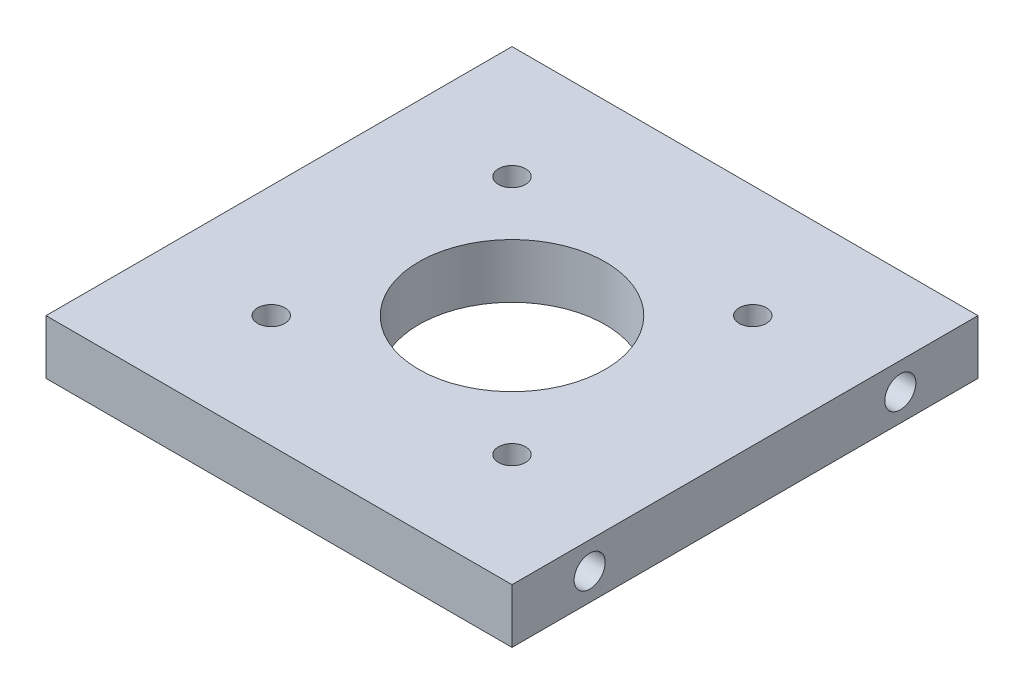
ISO-10303-21;
HEADER;
FILE_DESCRIPTION(('STEP AP214'),'2;1');
FILE_NAME('part.step','',(''),(''),'','','');
FILE_SCHEMA(('AUTOMOTIVE_DESIGN { 1 0 10303 214 1 1 1 1 }'));
ENDSEC;
DATA;
#1=APPLICATION_CONTEXT('core data for automotive mechanical design processes');
#2=APPLICATION_PROTOCOL_DEFINITION('international standard','automotive_design',2000,#1);
#3=PRODUCT_CONTEXT('',#1,'mechanical');
#4=PRODUCT('Part','Part','',(#3));
#5=PRODUCT_RELATED_PRODUCT_CATEGORY('part','',(#4));
#6=PRODUCT_DEFINITION_FORMATION('','',#4);
#7=PRODUCT_DEFINITION_CONTEXT('part definition',#1,'design');
#8=PRODUCT_DEFINITION('design','',#6,#7);
#9=PRODUCT_DEFINITION_SHAPE('','',#8);
#10=(LENGTH_UNIT() NAMED_UNIT(*) SI_UNIT(.MILLI.,.METRE.));
#11=(NAMED_UNIT(*) PLANE_ANGLE_UNIT() SI_UNIT($,.RADIAN.));
#12=(NAMED_UNIT(*) SI_UNIT($,.STERADIAN.) SOLID_ANGLE_UNIT());
#13=UNCERTAINTY_MEASURE_WITH_UNIT(LENGTH_MEASURE(1.E-05),#10,'distance_accuracy_value','');
#14=(GEOMETRIC_REPRESENTATION_CONTEXT(3) GLOBAL_UNCERTAINTY_ASSIGNED_CONTEXT((#13)) GLOBAL_UNIT_ASSIGNED_CONTEXT((#10,
#11,#12)) REPRESENTATION_CONTEXT('',''));
#15=CARTESIAN_POINT('',(0.,0.,0.));
#16=DIRECTION('',(0.,0.,1.));
#17=DIRECTION('',(1.,0.,0.));
#18=AXIS2_PLACEMENT_3D('',#15,#16,#17);
#19=CARTESIAN_POINT('',(50.0014,3.5084,50.000003548781));
#20=DIRECTION('',(-1.,0.,0.));
#21=DIRECTION('',(0.,0.,1.));
#22=AXIS2_PLACEMENT_3D('',#19,#20,#21);
#23=PLANE('',#22);
#24=CARTESIAN_POINT('',(50.0014,3.5084,50.000003548781));
#25=DIRECTION('',(-1.,0.,0.));
#26=DIRECTION('',(0.,0.,1.));
#27=AXIS2_PLACEMENT_3D('',#24,#25,#26);
#28=CIRCLE('',#27,2.);
#29=CARTESIAN_POINT('',(50.0014,3.5084,52.000003548781));
#30=VERTEX_POINT('',#29);
#31=EDGE_CURVE('E19',#30,#30,#28,.F.);
#32=ORIENTED_EDGE('',*,*,#31,.T.);
#33=EDGE_LOOP('',(#32));
#34=FACE_BOUND('',#33,.T.);
#35=ADVANCED_FACE('F16',(#34),#23,.F.);
#36=CARTESIAN_POINT('',(50.0014,3.5084,10.000003548781));
#37=DIRECTION('',(-1.,0.,0.));
#38=DIRECTION('',(0.,0.,1.));
#39=AXIS2_PLACEMENT_3D('',#36,#37,#38);
#40=PLANE('',#39);
#41=CARTESIAN_POINT('',(50.0014,3.5084,10.000003548781));
#42=DIRECTION('',(-1.,0.,0.));
#43=DIRECTION('',(0.,0.,1.));
#44=AXIS2_PLACEMENT_3D('',#41,#42,#43);
#45=CIRCLE('',#44,2.);
#46=CARTESIAN_POINT('',(50.0014,3.5084,12.000003548781));
#47=VERTEX_POINT('',#46);
#48=EDGE_CURVE('E128',#47,#47,#45,.F.);
#49=ORIENTED_EDGE('',*,*,#48,.T.);
#50=EDGE_LOOP('',(#49));
#51=FACE_BOUND('',#50,.T.);
#52=ADVANCED_FACE('F210',(#51),#40,.F.);
#53=CARTESIAN_POINT('',(10.0014,3.5084,50.000003548781));
#54=DIRECTION('',(1.,0.,0.));
#55=DIRECTION('',(0.,0.,-1.));
#56=AXIS2_PLACEMENT_3D('',#53,#54,#55);
#57=PLANE('',#56);
#58=CARTESIAN_POINT('',(10.0014,3.5084,50.000003548781));
#59=DIRECTION('',(1.,0.,0.));
#60=DIRECTION('',(0.,0.,-1.));
#61=AXIS2_PLACEMENT_3D('',#58,#59,#60);
#62=CIRCLE('',#61,2.);
#63=CARTESIAN_POINT('',(10.0014,3.5084,48.000003548781));
#64=VERTEX_POINT('',#63);
#65=EDGE_CURVE('E126',#64,#64,#62,.F.);
#66=ORIENTED_EDGE('',*,*,#65,.T.);
#67=EDGE_LOOP('',(#66));
#68=FACE_BOUND('',#67,.T.);
#69=ADVANCED_FACE('F150',(#68),#57,.F.);
#70=CARTESIAN_POINT('',(10.0014,3.5084,10.000003548781));
#71=DIRECTION('',(1.,0.,0.));
#72=DIRECTION('',(0.,0.,-1.));
#73=AXIS2_PLACEMENT_3D('',#70,#71,#72);
#74=PLANE('',#73);
#75=CARTESIAN_POINT('',(10.0014,3.5084,10.000003548781));
#76=DIRECTION('',(1.,0.,0.));
#77=DIRECTION('',(0.,0.,-1.));
#78=AXIS2_PLACEMENT_3D('',#75,#76,#77);
#79=CIRCLE('',#78,2.);
#80=CARTESIAN_POINT('',(10.0014,3.5084,8.000003548781));
#81=VERTEX_POINT('',#80);
#82=EDGE_CURVE('E74',#81,#81,#79,.F.);
#83=ORIENTED_EDGE('',*,*,#82,.T.);
#84=EDGE_LOOP('',(#83));
#85=FACE_BOUND('',#84,.T.);
#86=ADVANCED_FACE('F139',(#85),#74,.F.);
#87=CARTESIAN_POINT('',(60.0014,3.5084,50.000003548781));
#88=DIRECTION('',(-1.,0.,0.));
#89=DIRECTION('',(0.,0.,1.));
#90=AXIS2_PLACEMENT_3D('',#87,#88,#89);
#91=CYLINDRICAL_SURFACE('',#90,2.);
#92=CARTESIAN_POINT('',(60.0014,3.5084,50.000003548781));
#93=DIRECTION('',(-1.,0.,0.));
#94=DIRECTION('',(0.,0.,1.));
#95=AXIS2_PLACEMENT_3D('',#92,#93,#94);
#96=CIRCLE('',#95,2.);
#97=CARTESIAN_POINT('',(60.0014,3.5084,52.000003548781));
#98=VERTEX_POINT('',#97);
#99=EDGE_CURVE('E73',#98,#98,#96,.F.);
#100=ORIENTED_EDGE('',*,*,#99,.T.);
#101=EDGE_LOOP('',(#100));
#102=FACE_BOUND('',#101,.T.);
#103=ORIENTED_EDGE('',*,*,#31,.F.);
#104=EDGE_LOOP('',(#103));
#105=FACE_BOUND('',#104,.T.);
#106=ADVANCED_FACE('F136',(#102,#105),#91,.F.);
#107=CARTESIAN_POINT('',(60.0014,3.5084,10.000003548781));
#108=DIRECTION('',(-1.,0.,0.));
#109=DIRECTION('',(0.,0.,1.));
#110=AXIS2_PLACEMENT_3D('',#107,#108,#109);
#111=CYLINDRICAL_SURFACE('',#110,2.);
#112=CARTESIAN_POINT('',(60.0014,3.5084,10.000003548781));
#113=DIRECTION('',(-1.,0.,0.));
#114=DIRECTION('',(0.,0.,1.));
#115=AXIS2_PLACEMENT_3D('',#112,#113,#114);
#116=CIRCLE('',#115,2.);
#117=CARTESIAN_POINT('',(60.0014,3.5084,12.000003548781));
#118=VERTEX_POINT('',#117);
#119=EDGE_CURVE('E65',#118,#118,#116,.F.);
#120=ORIENTED_EDGE('',*,*,#119,.T.);
#121=EDGE_LOOP('',(#120));
#122=FACE_BOUND('',#121,.T.);
#123=ORIENTED_EDGE('',*,*,#48,.F.);
#124=EDGE_LOOP('',(#123));
#125=FACE_BOUND('',#124,.T.);
#126=ADVANCED_FACE('F138',(#122,#125),#111,.F.);
#127=CARTESIAN_POINT('',(0.00139999999999,3.5084,50.000003548781));
#128=DIRECTION('',(1.,0.,0.));
#129=DIRECTION('',(0.,0.,-1.));
#130=AXIS2_PLACEMENT_3D('',#127,#128,#129);
#131=CYLINDRICAL_SURFACE('',#130,2.);
#132=CARTESIAN_POINT('',(0.001399999999997,3.5084,50.000003548781));
#133=DIRECTION('',(1.,0.,0.));
#134=DIRECTION('',(0.,0.,-1.));
#135=AXIS2_PLACEMENT_3D('',#132,#133,#134);
#136=CIRCLE('',#135,2.);
#137=CARTESIAN_POINT('',(0.001399999999997,3.5084,48.000003548781));
#138=VERTEX_POINT('',#137);
#139=EDGE_CURVE('E117',#138,#138,#136,.T.);
#140=ORIENTED_EDGE('',*,*,#139,.F.);
#141=EDGE_LOOP('',(#140));
#142=FACE_BOUND('',#141,.T.);
#143=ORIENTED_EDGE('',*,*,#65,.F.);
#144=EDGE_LOOP('',(#143));
#145=FACE_BOUND('',#144,.T.);
#146=ADVANCED_FACE('F147',(#142,#145),#131,.F.);
#147=CARTESIAN_POINT('',(0.00139999999999,3.5084,10.000003548781));
#148=DIRECTION('',(1.,0.,0.));
#149=DIRECTION('',(0.,0.,-1.));
#150=AXIS2_PLACEMENT_3D('',#147,#148,#149);
#151=CYLINDRICAL_SURFACE('',#150,2.);
#152=CARTESIAN_POINT('',(0.001399999999997,3.5084,10.000003548781));
#153=DIRECTION('',(1.,0.,0.));
#154=DIRECTION('',(0.,0.,-1.));
#155=AXIS2_PLACEMENT_3D('',#152,#153,#154);
#156=CIRCLE('',#155,2.);
#157=CARTESIAN_POINT('',(0.001399999999997,3.5084,8.000003548781));
#158=VERTEX_POINT('',#157);
#159=EDGE_CURVE('E113',#158,#158,#156,.T.);
#160=ORIENTED_EDGE('',*,*,#159,.F.);
#161=EDGE_LOOP('',(#160));
#162=FACE_BOUND('',#161,.T.);
#163=ORIENTED_EDGE('',*,*,#82,.F.);
#164=EDGE_LOOP('',(#163));
#165=FACE_BOUND('',#164,.T.);
#166=ADVANCED_FACE('F196',(#162,#165),#151,.F.);
#167=CARTESIAN_POINT('',(60.0014,0.008400000000165,3.54878102371E-06));
#168=DIRECTION('',(0.,1.,0.));
#169=DIRECTION('',(0.,0.,1.));
#170=AXIS2_PLACEMENT_3D('',#167,#168,#169);
#171=PLANE('',#170);
#172=CARTESIAN_POINT('',(14.5014,0.008400000000051,45.500003548781));
#173=DIRECTION('',(0.,1.,0.));
#174=DIRECTION('',(0.,0.,1.));
#175=AXIS2_PLACEMENT_3D('',#172,#173,#174);
#176=CIRCLE('',#175,1.75);
#177=CARTESIAN_POINT('',(14.5014,0.008400000000051,47.250003548781));
#178=VERTEX_POINT('',#177);
#179=EDGE_CURVE('E97',#178,#178,#176,.T.);
#180=ORIENTED_EDGE('',*,*,#179,.T.);
#181=EDGE_LOOP('',(#180));
#182=FACE_BOUND('',#181,.T.);
#183=CARTESIAN_POINT('',(30.0014,0.008400000000051,30.000003548781));
#184=DIRECTION('',(0.,1.,0.));
#185=DIRECTION('',(0.,0.,1.));
#186=AXIS2_PLACEMENT_3D('',#183,#184,#185);
#187=CIRCLE('',#186,12.);
#188=CARTESIAN_POINT('',(30.0014,0.008400000000051,42.000003548781));
#189=VERTEX_POINT('',#188);
#190=EDGE_CURVE('E101',#189,#189,#187,.T.);
#191=ORIENTED_EDGE('',*,*,#190,.T.);
#192=EDGE_LOOP('',(#191));
#193=FACE_BOUND('',#192,.T.);
#194=CARTESIAN_POINT('',(45.5014,0.008400000000051,45.500003548781));
#195=DIRECTION('',(0.,1.,0.));
#196=DIRECTION('',(0.,0.,1.));
#197=AXIS2_PLACEMENT_3D('',#194,#195,#196);
#198=CIRCLE('',#197,1.75);
#199=CARTESIAN_POINT('',(45.5014,0.008400000000051,47.250003548781));
#200=VERTEX_POINT('',#199);
#201=EDGE_CURVE('E104',#200,#200,#198,.T.);
#202=ORIENTED_EDGE('',*,*,#201,.T.);
#203=EDGE_LOOP('',(#202));
#204=FACE_BOUND('',#203,.T.);
#205=CARTESIAN_POINT('',(14.5014,0.008400000000051,14.500003548781));
#206=DIRECTION('',(0.,1.,0.));
#207=DIRECTION('',(0.,0.,1.));
#208=AXIS2_PLACEMENT_3D('',#205,#206,#207);
#209=CIRCLE('',#208,1.75);
#210=CARTESIAN_POINT('',(14.5014,0.008400000000051,16.250003548781));
#211=VERTEX_POINT('',#210);
#212=EDGE_CURVE('E107',#211,#211,#209,.T.);
#213=ORIENTED_EDGE('',*,*,#212,.T.);
#214=EDGE_LOOP('',(#213));
#215=FACE_BOUND('',#214,.T.);
#216=CARTESIAN_POINT('',(45.5014,0.008400000000051,14.500003548781));
#217=DIRECTION('',(0.,1.,0.));
#218=DIRECTION('',(0.,0.,1.));
#219=AXIS2_PLACEMENT_3D('',#216,#217,#218);
#220=CIRCLE('',#219,1.75);
#221=CARTESIAN_POINT('',(45.5014,0.008400000000051,16.250003548781));
#222=VERTEX_POINT('',#221);
#223=EDGE_CURVE('E110',#222,#222,#220,.T.);
#224=ORIENTED_EDGE('',*,*,#223,.T.);
#225=EDGE_LOOP('',(#224));
#226=FACE_BOUND('',#225,.T.);
#227=DIRECTION('',(0.,0.,1.));
#228=VECTOR('',#227,1.);
#229=CARTESIAN_POINT('',(0.00139999999999,0.008400000000051,3.54878102371E-06));
#230=LINE('',#229,#228);
#231=CARTESIAN_POINT('',(0.00139999999999647,0.0084000000000795,3.548780910023E-06));
#232=VERTEX_POINT('',#231);
#233=CARTESIAN_POINT('',(0.00139999999999647,0.008400000000108,60.000003548781));
#234=VERTEX_POINT('',#233);
#235=EDGE_CURVE('E62',#232,#234,#230,.T.);
#236=ORIENTED_EDGE('',*,*,#235,.F.);
#237=DIRECTION('',(1.,0.,0.));
#238=VECTOR('',#237,1.);
#239=CARTESIAN_POINT('',(60.0014,0.008400000000051,3.54878102371E-06));
#240=LINE('',#239,#238);
#241=CARTESIAN_POINT('',(60.0014,0.008400000000108,3.5487808531795E-06));
#242=VERTEX_POINT('',#241);
#243=EDGE_CURVE('E55',#232,#242,#240,.T.);
#244=ORIENTED_EDGE('',*,*,#243,.T.);
#245=DIRECTION('',(0.,0.,1.));
#246=VECTOR('',#245,1.);
#247=CARTESIAN_POINT('',(60.0014,0.008400000000051,3.54878102371E-06));
#248=LINE('',#247,#246);
#249=CARTESIAN_POINT('',(60.0014,0.008400000000108,60.000003548781));
#250=VERTEX_POINT('',#249);
#251=EDGE_CURVE('E60',#242,#250,#248,.T.);
#252=ORIENTED_EDGE('',*,*,#251,.T.);
#253=DIRECTION('',(1.,0.,0.));
#254=VECTOR('',#253,1.);
#255=CARTESIAN_POINT('',(60.0014,0.008400000000051,60.000003548781));
#256=LINE('',#255,#254);
#257=EDGE_CURVE('E116',#234,#250,#256,.T.);
#258=ORIENTED_EDGE('',*,*,#257,.F.);
#259=EDGE_LOOP('',(#236,#244,#252,#258));
#260=FACE_BOUND('',#259,.T.);
#261=ADVANCED_FACE('F59',(#182,#193,#204,#215,#226,#260),#171,.F.);
#262=CARTESIAN_POINT('',(60.0014,0.008400000000165,3.54878102371E-06));
#263=DIRECTION('',(-1.,0.,0.));
#264=DIRECTION('',(0.,0.,1.));
#265=AXIS2_PLACEMENT_3D('',#262,#263,#264);
#266=PLANE('',#265);
#267=ORIENTED_EDGE('',*,*,#119,.F.);
#268=EDGE_LOOP('',(#267));
#269=FACE_BOUND('',#268,.T.);
#270=ORIENTED_EDGE('',*,*,#99,.F.);
#271=EDGE_LOOP('',(#270));
#272=FACE_BOUND('',#271,.T.);
#273=DIRECTION('',(0.,1.,0.));
#274=VECTOR('',#273,1.);
#275=CARTESIAN_POINT('',(60.0014,0.008400000000165,60.000003548781));
#276=LINE('',#275,#274);
#277=CARTESIAN_POINT('',(60.0014,7.0084,60.000003548781));
#278=VERTEX_POINT('',#277);
#279=EDGE_CURVE('E71',#250,#278,#276,.T.);
#280=ORIENTED_EDGE('',*,*,#279,.F.);
#281=ORIENTED_EDGE('',*,*,#251,.F.);
#282=DIRECTION('',(0.,1.,0.));
#283=VECTOR('',#282,1.);
#284=CARTESIAN_POINT('',(60.0014,0.008400000000165,3.54878102371E-06));
#285=LINE('',#284,#283);
#286=CARTESIAN_POINT('',(60.0014,7.0084,3.5487808531795E-06));
#287=VERTEX_POINT('',#286);
#288=EDGE_CURVE('E64',#242,#287,#285,.T.);
#289=ORIENTED_EDGE('',*,*,#288,.T.);
#290=DIRECTION('',(0.,0.,1.));
#291=VECTOR('',#290,1.);
#292=CARTESIAN_POINT('',(60.0014,7.0084,3.54878102371E-06));
#293=LINE('',#292,#291);
#294=EDGE_CURVE('E100',#278,#287,#293,.F.);
#295=ORIENTED_EDGE('',*,*,#294,.F.);
#296=EDGE_LOOP('',(#280,#281,#289,#295));
#297=FACE_BOUND('',#296,.T.);
#298=ADVANCED_FACE('F68',(#269,#272,#297),#266,.F.);
#299=CARTESIAN_POINT('',(60.0014,0.008400000000165,3.54878102371E-06));
#300=DIRECTION('',(0.,0.,1.));
#301=DIRECTION('',(1.,0.,0.));
#302=AXIS2_PLACEMENT_3D('',#299,#300,#301);
#303=PLANE('',#302);
#304=DIRECTION('',(1.,0.,0.));
#305=VECTOR('',#304,1.);
#306=CARTESIAN_POINT('',(60.0014,7.0084,3.548780796336E-06));
#307=LINE('',#306,#305);
#308=CARTESIAN_POINT('',(0.00139999999999647,7.0084,3.548780910023E-06));
#309=VERTEX_POINT('',#308);
#310=EDGE_CURVE('E78',#287,#309,#307,.F.);
#311=ORIENTED_EDGE('',*,*,#310,.F.);
#312=ORIENTED_EDGE('',*,*,#288,.F.);
#313=ORIENTED_EDGE('',*,*,#243,.F.);
#314=DIRECTION('',(0.,1.,0.));
#315=VECTOR('',#314,1.);
#316=CARTESIAN_POINT('',(0.00139999999999,0.008400000000165,3.548780796336E-06));
#317=LINE('',#316,#315);
#318=EDGE_CURVE('E80',#309,#232,#317,.F.);
#319=ORIENTED_EDGE('',*,*,#318,.F.);
#320=EDGE_LOOP('',(#311,#312,#313,#319));
#321=FACE_BOUND('',#320,.T.);
#322=ADVANCED_FACE('F76',(#321),#303,.F.);
#323=CARTESIAN_POINT('',(0.00139999999999,0.008400000000165,3.54878102371E-06));
#324=DIRECTION('',(-1.,0.,0.));
#325=DIRECTION('',(0.,0.,1.));
#326=AXIS2_PLACEMENT_3D('',#323,#324,#325);
#327=PLANE('',#326);
#328=ORIENTED_EDGE('',*,*,#159,.T.);
#329=EDGE_LOOP('',(#328));
#330=FACE_BOUND('',#329,.T.);
#331=ORIENTED_EDGE('',*,*,#139,.T.);
#332=EDGE_LOOP('',(#331));
#333=FACE_BOUND('',#332,.T.);
#334=DIRECTION('',(0.,1.,0.));
#335=VECTOR('',#334,1.);
#336=CARTESIAN_POINT('',(0.00139999999999862,0.008400000000165,60.000003548781));
#337=LINE('',#336,#335);
#338=CARTESIAN_POINT('',(0.00139999999999431,7.0084,60.000003548781));
#339=VERTEX_POINT('',#338);
#340=EDGE_CURVE('E34',#339,#234,#337,.F.);
#341=ORIENTED_EDGE('',*,*,#340,.F.);
#342=DIRECTION('',(0.,0.,1.));
#343=VECTOR('',#342,1.);
#344=CARTESIAN_POINT('',(0.00139999999999862,7.0084,3.54878102371E-06));
#345=LINE('',#344,#343);
#346=EDGE_CURVE('E348',#309,#339,#345,.T.);
#347=ORIENTED_EDGE('',*,*,#346,.F.);
#348=ORIENTED_EDGE('',*,*,#318,.T.);
#349=ORIENTED_EDGE('',*,*,#235,.T.);
#350=EDGE_LOOP('',(#341,#347,#348,#349));
#351=FACE_BOUND('',#350,.T.);
#352=ADVANCED_FACE('F184',(#330,#333,#351),#327,.T.);
#353=CARTESIAN_POINT('',(60.0014,0.008400000000165,60.000003548781));
#354=DIRECTION('',(0.,0.,1.));
#355=DIRECTION('',(1.,0.,0.));
#356=AXIS2_PLACEMENT_3D('',#353,#354,#355);
#357=PLANE('',#356);
#358=DIRECTION('',(1.,0.,0.));
#359=VECTOR('',#358,1.);
#360=CARTESIAN_POINT('',(60.0014,7.0084,60.000003548781));
#361=LINE('',#360,#359);
#362=EDGE_CURVE('E96',#339,#278,#361,.T.);
#363=ORIENTED_EDGE('',*,*,#362,.F.);
#364=ORIENTED_EDGE('',*,*,#340,.T.);
#365=ORIENTED_EDGE('',*,*,#257,.T.);
#366=ORIENTED_EDGE('',*,*,#279,.T.);
#367=EDGE_LOOP('',(#363,#364,#365,#366));
#368=FACE_BOUND('',#367,.T.);
#369=ADVANCED_FACE('F180',(#368),#357,.T.);
#370=CARTESIAN_POINT('',(45.5014,0.008400000000165,14.500003548781));
#371=DIRECTION('',(0.,1.,0.));
#372=DIRECTION('',(0.,0.,1.));
#373=AXIS2_PLACEMENT_3D('',#370,#371,#372);
#374=CYLINDRICAL_SURFACE('',#373,1.75);
#375=ORIENTED_EDGE('',*,*,#223,.F.);
#376=EDGE_LOOP('',(#375));
#377=FACE_BOUND('',#376,.T.);
#378=CARTESIAN_POINT('',(45.5014,7.0084,14.500003548781));
#379=DIRECTION('',(0.,1.,0.));
#380=DIRECTION('',(0.,0.,1.));
#381=AXIS2_PLACEMENT_3D('',#378,#379,#380);
#382=CIRCLE('',#381,1.75);
#383=CARTESIAN_POINT('',(45.5014,7.0084,16.250003548781));
#384=VERTEX_POINT('',#383);
#385=EDGE_CURVE('E93',#384,#384,#382,.F.);
#386=ORIENTED_EDGE('',*,*,#385,.F.);
#387=EDGE_LOOP('',(#386));
#388=FACE_BOUND('',#387,.T.);
#389=ADVANCED_FACE('F176',(#377,#388),#374,.F.);
#390=CARTESIAN_POINT('',(14.5014,0.008400000000165,14.500003548781));
#391=DIRECTION('',(0.,1.,0.));
#392=DIRECTION('',(0.,0.,1.));
#393=AXIS2_PLACEMENT_3D('',#390,#391,#392);
#394=CYLINDRICAL_SURFACE('',#393,1.75);
#395=ORIENTED_EDGE('',*,*,#212,.F.);
#396=EDGE_LOOP('',(#395));
#397=FACE_BOUND('',#396,.T.);
#398=CARTESIAN_POINT('',(14.5014,7.0084,14.500003548781));
#399=DIRECTION('',(0.,1.,0.));
#400=DIRECTION('',(0.,0.,1.));
#401=AXIS2_PLACEMENT_3D('',#398,#399,#400);
#402=CIRCLE('',#401,1.75);
#403=CARTESIAN_POINT('',(14.5014,7.0084,16.250003548781));
#404=VERTEX_POINT('',#403);
#405=EDGE_CURVE('E90',#404,#404,#402,.F.);
#406=ORIENTED_EDGE('',*,*,#405,.F.);
#407=EDGE_LOOP('',(#406));
#408=FACE_BOUND('',#407,.T.);
#409=ADVANCED_FACE('F172',(#397,#408),#394,.F.);
#410=CARTESIAN_POINT('',(45.5014,0.008400000000165,45.500003548781));
#411=DIRECTION('',(0.,1.,0.));
#412=DIRECTION('',(0.,0.,1.));
#413=AXIS2_PLACEMENT_3D('',#410,#411,#412);
#414=CYLINDRICAL_SURFACE('',#413,1.75);
#415=ORIENTED_EDGE('',*,*,#201,.F.);
#416=EDGE_LOOP('',(#415));
#417=FACE_BOUND('',#416,.T.);
#418=CARTESIAN_POINT('',(45.5014,7.0084,45.500003548781));
#419=DIRECTION('',(0.,1.,0.));
#420=DIRECTION('',(0.,0.,1.));
#421=AXIS2_PLACEMENT_3D('',#418,#419,#420);
#422=CIRCLE('',#421,1.75);
#423=CARTESIAN_POINT('',(45.5014,7.0084,47.250003548781));
#424=VERTEX_POINT('',#423);
#425=EDGE_CURVE('E87',#424,#424,#422,.F.);
#426=ORIENTED_EDGE('',*,*,#425,.F.);
#427=EDGE_LOOP('',(#426));
#428=FACE_BOUND('',#427,.T.);
#429=ADVANCED_FACE('F168',(#417,#428),#414,.F.);
#430=CARTESIAN_POINT('',(30.0014,0.008400000000165,30.000003548781));
#431=DIRECTION('',(0.,1.,0.));
#432=DIRECTION('',(0.,0.,1.));
#433=AXIS2_PLACEMENT_3D('',#430,#431,#432);
#434=CYLINDRICAL_SURFACE('',#433,12.);
#435=ORIENTED_EDGE('',*,*,#190,.F.);
#436=EDGE_LOOP('',(#435));
#437=FACE_BOUND('',#436,.T.);
#438=CARTESIAN_POINT('',(30.0014,7.0084,30.000003548781));
#439=DIRECTION('',(0.,1.,0.));
#440=DIRECTION('',(0.,0.,1.));
#441=AXIS2_PLACEMENT_3D('',#438,#439,#440);
#442=CIRCLE('',#441,12.);
#443=CARTESIAN_POINT('',(30.0014,7.0084,42.000003548781));
#444=VERTEX_POINT('',#443);
#445=EDGE_CURVE('E25',#444,#444,#442,.F.);
#446=ORIENTED_EDGE('',*,*,#445,.F.);
#447=EDGE_LOOP('',(#446));
#448=FACE_BOUND('',#447,.T.);
#449=ADVANCED_FACE('F161',(#437,#448),#434,.F.);
#450=CARTESIAN_POINT('',(14.5014,0.008400000000165,45.500003548781));
#451=DIRECTION('',(0.,1.,0.));
#452=DIRECTION('',(0.,0.,1.));
#453=AXIS2_PLACEMENT_3D('',#450,#451,#452);
#454=CYLINDRICAL_SURFACE('',#453,1.75);
#455=ORIENTED_EDGE('',*,*,#179,.F.);
#456=EDGE_LOOP('',(#455));
#457=FACE_BOUND('',#456,.T.);
#458=CARTESIAN_POINT('',(14.5014,7.0084,45.500003548781));
#459=DIRECTION('',(0.,1.,0.));
#460=DIRECTION('',(0.,0.,1.));
#461=AXIS2_PLACEMENT_3D('',#458,#459,#460);
#462=CIRCLE('',#461,1.75);
#463=CARTESIAN_POINT('',(14.5014,7.0084,47.250003548781));
#464=VERTEX_POINT('',#463);
#465=EDGE_CURVE('E11',#464,#464,#462,.F.);
#466=ORIENTED_EDGE('',*,*,#465,.F.);
#467=EDGE_LOOP('',(#466));
#468=FACE_BOUND('',#467,.T.);
#469=ADVANCED_FACE('F155',(#457,#468),#454,.F.);
#470=CARTESIAN_POINT('',(60.0014,7.0084,3.54878102371E-06));
#471=DIRECTION('',(0.,1.,0.));
#472=DIRECTION('',(0.,0.,1.));
#473=AXIS2_PLACEMENT_3D('',#470,#471,#472);
#474=PLANE('',#473);
#475=ORIENTED_EDGE('',*,*,#465,.T.);
#476=EDGE_LOOP('',(#475));
#477=FACE_BOUND('',#476,.T.);
#478=ORIENTED_EDGE('',*,*,#445,.T.);
#479=EDGE_LOOP('',(#478));
#480=FACE_BOUND('',#479,.T.);
#481=ORIENTED_EDGE('',*,*,#425,.T.);
#482=EDGE_LOOP('',(#481));
#483=FACE_BOUND('',#482,.T.);
#484=ORIENTED_EDGE('',*,*,#405,.T.);
#485=EDGE_LOOP('',(#484));
#486=FACE_BOUND('',#485,.T.);
#487=ORIENTED_EDGE('',*,*,#385,.T.);
#488=EDGE_LOOP('',(#487));
#489=FACE_BOUND('',#488,.T.);
#490=ORIENTED_EDGE('',*,*,#346,.T.);
#491=ORIENTED_EDGE('',*,*,#362,.T.);
#492=ORIENTED_EDGE('',*,*,#294,.T.);
#493=ORIENTED_EDGE('',*,*,#310,.T.);
#494=EDGE_LOOP('',(#490,#491,#492,#493));
#495=FACE_BOUND('',#494,.T.);
#496=ADVANCED_FACE('F153',(#477,#480,#483,#486,#489,#495),#474,.T.);
#497=CLOSED_SHELL('',(#35,#52,#69,#86,#106,#126,#146,#166,#261,#298,#322,#352,#369,#389,#409,
#429,#449,#469,#496));
#498=MANIFOLD_SOLID_BREP('B1',#497);
#499=ADVANCED_BREP_SHAPE_REPRESENTATION('',(#18,#498),#14);
#500=SHAPE_DEFINITION_REPRESENTATION(#9,#499);
ENDSEC;
END-ISO-10303-21;
